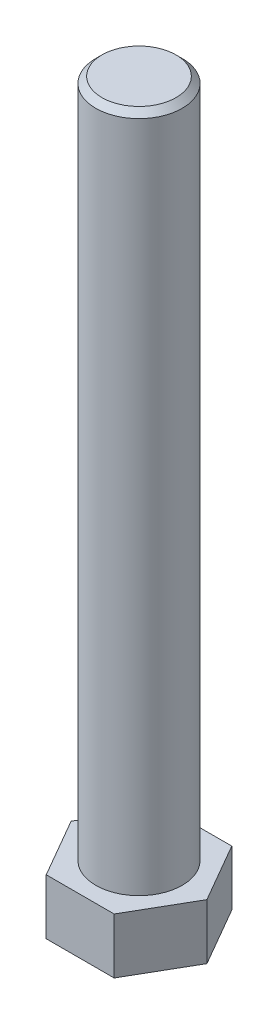
ISO-10303-21;
HEADER;
FILE_DESCRIPTION(('STEP AP214'),'2;1');
FILE_NAME('part.step','',(''),(''),'','','');
FILE_SCHEMA(('AUTOMOTIVE_DESIGN { 1 0 10303 214 1 1 1 1 }'));
ENDSEC;
DATA;
#1=APPLICATION_CONTEXT('core data for automotive mechanical design processes');
#2=APPLICATION_PROTOCOL_DEFINITION('international standard','automotive_design',2000,#1);
#3=PRODUCT_CONTEXT('',#1,'mechanical');
#4=PRODUCT('Part','Part','',(#3));
#5=PRODUCT_RELATED_PRODUCT_CATEGORY('part','',(#4));
#6=PRODUCT_DEFINITION_FORMATION('','',#4);
#7=PRODUCT_DEFINITION_CONTEXT('part definition',#1,'design');
#8=PRODUCT_DEFINITION('design','',#6,#7);
#9=PRODUCT_DEFINITION_SHAPE('','',#8);
#10=(LENGTH_UNIT() NAMED_UNIT(*) SI_UNIT(.MILLI.,.METRE.));
#11=(NAMED_UNIT(*) PLANE_ANGLE_UNIT() SI_UNIT($,.RADIAN.));
#12=(NAMED_UNIT(*) SI_UNIT($,.STERADIAN.) SOLID_ANGLE_UNIT());
#13=UNCERTAINTY_MEASURE_WITH_UNIT(LENGTH_MEASURE(1.E-05),#10,'distance_accuracy_value','');
#14=(GEOMETRIC_REPRESENTATION_CONTEXT(3) GLOBAL_UNCERTAINTY_ASSIGNED_CONTEXT((#13)) GLOBAL_UNIT_ASSIGNED_CONTEXT((#10,
#11,#12)) REPRESENTATION_CONTEXT('',''));
#15=CARTESIAN_POINT('',(0.,0.,0.));
#16=DIRECTION('',(0.,0.,1.));
#17=DIRECTION('',(1.,0.,0.));
#18=AXIS2_PLACEMENT_3D('',#15,#16,#17);
#19=CARTESIAN_POINT('',(5.50000000000011,8.98,9.52627944162876));
#20=DIRECTION('',(-0.866025403784441,0.,-0.499999999999995));
#21=DIRECTION('',(-0.499999999999995,0.,0.866025403784442));
#22=AXIS2_PLACEMENT_3D('',#19,#20,#21);
#23=PLANE('',#22);
#24=DIRECTION('',(0.499999999999995,0.,-0.866025403784441));
#25=VECTOR('',#24,1.);
#26=CARTESIAN_POINT('',(5.50000000000011,0.,9.52627944162876));
#27=LINE('',#26,#25);
#28=CARTESIAN_POINT('',(5.50000000000011,0.,9.52627944162876));
#29=VERTEX_POINT('',#28);
#30=CARTESIAN_POINT('',(11.,0.,0.));
#31=VERTEX_POINT('',#30);
#32=EDGE_CURVE('E137',#29,#31,#27,.T.);
#33=ORIENTED_EDGE('',*,*,#32,.T.);
#34=DIRECTION('',(0.,-1.,0.));
#35=VECTOR('',#34,1.);
#36=CARTESIAN_POINT('',(11.,8.98,0.));
#37=LINE('',#36,#35);
#38=CARTESIAN_POINT('',(11.,8.98,0.));
#39=VERTEX_POINT('',#38);
#40=EDGE_CURVE('E164',#39,#31,#37,.T.);
#41=ORIENTED_EDGE('',*,*,#40,.F.);
#42=DIRECTION('',(0.499999999999995,0.,-0.866025403784441));
#43=VECTOR('',#42,1.);
#44=CARTESIAN_POINT('',(5.50000000000011,8.98,9.52627944162876));
#45=LINE('',#44,#43);
#46=CARTESIAN_POINT('',(5.50000000000011,8.98,9.52627944162876));
#47=VERTEX_POINT('',#46);
#48=EDGE_CURVE('E153',#47,#39,#45,.T.);
#49=ORIENTED_EDGE('',*,*,#48,.F.);
#50=DIRECTION('',(0.,-1.,0.));
#51=VECTOR('',#50,1.);
#52=CARTESIAN_POINT('',(5.50000000000011,8.98,9.52627944162876));
#53=LINE('',#52,#51);
#54=EDGE_CURVE('E133',#47,#29,#53,.T.);
#55=ORIENTED_EDGE('',*,*,#54,.T.);
#56=EDGE_LOOP('',(#33,#41,#49,#55));
#57=FACE_BOUND('',#56,.T.);
#58=ADVANCED_FACE('F45',(#57),#23,.F.);
#59=CARTESIAN_POINT('',(11.,8.98,0.));
#60=DIRECTION('',(-0.866025403784438,0.,0.500000000000001));
#61=DIRECTION('',(0.500000000000001,0.,0.866025403784438));
#62=AXIS2_PLACEMENT_3D('',#59,#60,#61);
#63=PLANE('',#62);
#64=DIRECTION('',(-0.500000000000001,0.,-0.866025403784438));
#65=VECTOR('',#64,1.);
#66=CARTESIAN_POINT('',(11.,0.,0.));
#67=LINE('',#66,#65);
#68=CARTESIAN_POINT('',(5.49999999999998,0.,-9.52627944162884));
#69=VERTEX_POINT('',#68);
#70=EDGE_CURVE('E141',#31,#69,#67,.T.);
#71=ORIENTED_EDGE('',*,*,#70,.T.);
#72=DIRECTION('',(0.,-1.,0.));
#73=VECTOR('',#72,1.);
#74=CARTESIAN_POINT('',(5.49999999999998,8.98,-9.52627944162884));
#75=LINE('',#74,#73);
#76=CARTESIAN_POINT('',(5.49999999999998,8.98,-9.52627944162884));
#77=VERTEX_POINT('',#76);
#78=EDGE_CURVE('E160',#77,#69,#75,.T.);
#79=ORIENTED_EDGE('',*,*,#78,.F.);
#80=DIRECTION('',(-0.500000000000001,0.,-0.866025403784438));
#81=VECTOR('',#80,1.);
#82=CARTESIAN_POINT('',(11.,8.98,0.));
#83=LINE('',#82,#81);
#84=EDGE_CURVE('E102',#39,#77,#83,.T.);
#85=ORIENTED_EDGE('',*,*,#84,.F.);
#86=ORIENTED_EDGE('',*,*,#40,.T.);
#87=EDGE_LOOP('',(#71,#79,#85,#86));
#88=FACE_BOUND('',#87,.T.);
#89=ADVANCED_FACE('F183',(#88),#63,.F.);
#90=CARTESIAN_POINT('',(5.49999999999998,8.98,-9.52627944162884));
#91=DIRECTION('',(0.,0.,1.));
#92=DIRECTION('',(1.,0.,0.));
#93=AXIS2_PLACEMENT_3D('',#90,#91,#92);
#94=PLANE('',#93);
#95=DIRECTION('',(-1.,0.,0.));
#96=VECTOR('',#95,1.);
#97=CARTESIAN_POINT('',(5.49999999999998,0.,-9.52627944162884));
#98=LINE('',#97,#96);
#99=CARTESIAN_POINT('',(-5.50000000000004,0.,-9.5262794416288));
#100=VERTEX_POINT('',#99);
#101=EDGE_CURVE('E144',#69,#100,#98,.T.);
#102=ORIENTED_EDGE('',*,*,#101,.T.);
#103=DIRECTION('',(0.,-1.,0.));
#104=VECTOR('',#103,1.);
#105=CARTESIAN_POINT('',(-5.50000000000004,8.98,-9.5262794416288));
#106=LINE('',#105,#104);
#107=CARTESIAN_POINT('',(-5.50000000000004,8.98,-9.5262794416288));
#108=VERTEX_POINT('',#107);
#109=EDGE_CURVE('E126',#108,#100,#106,.T.);
#110=ORIENTED_EDGE('',*,*,#109,.F.);
#111=DIRECTION('',(-1.,0.,0.));
#112=VECTOR('',#111,1.);
#113=CARTESIAN_POINT('',(5.49999999999998,8.98,-9.52627944162884));
#114=LINE('',#113,#112);
#115=EDGE_CURVE('E115',#77,#108,#114,.T.);
#116=ORIENTED_EDGE('',*,*,#115,.F.);
#117=ORIENTED_EDGE('',*,*,#78,.T.);
#118=EDGE_LOOP('',(#102,#110,#116,#117));
#119=FACE_BOUND('',#118,.T.);
#120=ADVANCED_FACE('F186',(#119),#94,.F.);
#121=CARTESIAN_POINT('',(-5.50000000000004,8.98,-9.5262794416288));
#122=DIRECTION('',(0.866025403784442,0.,0.499999999999995));
#123=DIRECTION('',(0.499999999999995,0.,-0.866025403784442));
#124=AXIS2_PLACEMENT_3D('',#121,#122,#123);
#125=PLANE('',#124);
#126=DIRECTION('',(-0.499999999999995,0.,0.866025403784441));
#127=VECTOR('',#126,1.);
#128=CARTESIAN_POINT('',(-5.50000000000004,0.,-9.5262794416288));
#129=LINE('',#128,#127);
#130=CARTESIAN_POINT('',(-11.,0.,0.));
#131=VERTEX_POINT('',#130);
#132=EDGE_CURVE('E124',#100,#131,#129,.T.);
#133=ORIENTED_EDGE('',*,*,#132,.T.);
#134=DIRECTION('',(0.,-1.,0.));
#135=VECTOR('',#134,1.);
#136=CARTESIAN_POINT('',(-11.,8.98,0.));
#137=LINE('',#136,#135);
#138=CARTESIAN_POINT('',(-11.,8.98,0.));
#139=VERTEX_POINT('',#138);
#140=EDGE_CURVE('E121',#139,#131,#137,.T.);
#141=ORIENTED_EDGE('',*,*,#140,.F.);
#142=DIRECTION('',(-0.499999999999995,0.,0.866025403784441));
#143=VECTOR('',#142,1.);
#144=CARTESIAN_POINT('',(-5.50000000000004,8.98,-9.5262794416288));
#145=LINE('',#144,#143);
#146=EDGE_CURVE('E109',#108,#139,#145,.T.);
#147=ORIENTED_EDGE('',*,*,#146,.F.);
#148=ORIENTED_EDGE('',*,*,#109,.T.);
#149=EDGE_LOOP('',(#133,#141,#147,#148));
#150=FACE_BOUND('',#149,.T.);
#151=ADVANCED_FACE('F122',(#150),#125,.F.);
#152=CARTESIAN_POINT('',(-11.,8.98,0.));
#153=DIRECTION('',(0.866025403784434,0.,-0.500000000000007));
#154=DIRECTION('',(-0.500000000000007,0.,-0.866025403784435));
#155=AXIS2_PLACEMENT_3D('',#152,#153,#154);
#156=PLANE('',#155);
#157=DIRECTION('',(0.500000000000007,0.,0.866025403784434));
#158=VECTOR('',#157,1.);
#159=CARTESIAN_POINT('',(-11.,0.,0.));
#160=LINE('',#159,#158);
#161=CARTESIAN_POINT('',(-5.49999999999991,0.,9.52627944162887));
#162=VERTEX_POINT('',#161);
#163=EDGE_CURVE('E87',#131,#162,#160,.T.);
#164=ORIENTED_EDGE('',*,*,#163,.T.);
#165=DIRECTION('',(0.,-1.,0.));
#166=VECTOR('',#165,1.);
#167=CARTESIAN_POINT('',(-5.49999999999991,8.98,9.52627944162887));
#168=LINE('',#167,#166);
#169=CARTESIAN_POINT('',(-5.49999999999991,8.98,9.52627944162887));
#170=VERTEX_POINT('',#169);
#171=EDGE_CURVE('E127',#170,#162,#168,.T.);
#172=ORIENTED_EDGE('',*,*,#171,.F.);
#173=DIRECTION('',(0.500000000000007,0.,0.866025403784434));
#174=VECTOR('',#173,1.);
#175=CARTESIAN_POINT('',(-11.,8.98,0.));
#176=LINE('',#175,#174);
#177=EDGE_CURVE('E113',#139,#170,#176,.T.);
#178=ORIENTED_EDGE('',*,*,#177,.F.);
#179=ORIENTED_EDGE('',*,*,#140,.T.);
#180=EDGE_LOOP('',(#164,#172,#178,#179));
#181=FACE_BOUND('',#180,.T.);
#182=ADVANCED_FACE('F129',(#181),#156,.F.);
#183=CARTESIAN_POINT('',(-5.49999999999991,8.98,9.52627944162887));
#184=DIRECTION('',(0.,0.,-1.));
#185=DIRECTION('',(-1.,0.,0.));
#186=AXIS2_PLACEMENT_3D('',#183,#184,#185);
#187=PLANE('',#186);
#188=DIRECTION('',(1.,0.,0.));
#189=VECTOR('',#188,1.);
#190=CARTESIAN_POINT('',(-5.49999999999991,0.,9.52627944162887));
#191=LINE('',#190,#189);
#192=EDGE_CURVE('E93',#162,#29,#191,.T.);
#193=ORIENTED_EDGE('',*,*,#192,.T.);
#194=ORIENTED_EDGE('',*,*,#54,.F.);
#195=DIRECTION('',(1.,0.,0.));
#196=VECTOR('',#195,1.);
#197=CARTESIAN_POINT('',(-5.49999999999991,8.98,9.52627944162887));
#198=LINE('',#197,#196);
#199=EDGE_CURVE('E64',#170,#47,#198,.T.);
#200=ORIENTED_EDGE('',*,*,#199,.F.);
#201=ORIENTED_EDGE('',*,*,#171,.T.);
#202=EDGE_LOOP('',(#193,#194,#200,#201));
#203=FACE_BOUND('',#202,.T.);
#204=ADVANCED_FACE('F191',(#203),#187,.F.);
#205=CARTESIAN_POINT('',(0.,8.98,0.));
#206=DIRECTION('',(0.,1.,0.));
#207=DIRECTION('',(0.,0.,1.));
#208=AXIS2_PLACEMENT_3D('',#205,#206,#207);
#209=PLANE('',#208);
#210=CARTESIAN_POINT('',(0.,8.98,0.));
#211=DIRECTION('',(0.,1.,0.));
#212=DIRECTION('',(0.,0.,1.));
#213=AXIS2_PLACEMENT_3D('',#210,#211,#212);
#214=CIRCLE('',#213,7.);
#215=CARTESIAN_POINT('',(0.,8.98,7.));
#216=VERTEX_POINT('',#215);
#217=EDGE_CURVE('E166',#216,#216,#214,.T.);
#218=ORIENTED_EDGE('',*,*,#217,.F.);
#219=EDGE_LOOP('',(#218));
#220=FACE_BOUND('',#219,.T.);
#221=ORIENTED_EDGE('',*,*,#48,.T.);
#222=ORIENTED_EDGE('',*,*,#84,.T.);
#223=ORIENTED_EDGE('',*,*,#115,.T.);
#224=ORIENTED_EDGE('',*,*,#146,.T.);
#225=ORIENTED_EDGE('',*,*,#177,.T.);
#226=ORIENTED_EDGE('',*,*,#199,.T.);
#227=EDGE_LOOP('',(#221,#222,#223,#224,#225,#226));
#228=FACE_BOUND('',#227,.T.);
#229=ADVANCED_FACE('F111',(#220,#228),#209,.T.);
#230=CARTESIAN_POINT('',(0.,0.,0.));
#231=DIRECTION('',(0.,1.,0.));
#232=DIRECTION('',(0.,0.,1.));
#233=AXIS2_PLACEMENT_3D('',#230,#231,#232);
#234=PLANE('',#233);
#235=ORIENTED_EDGE('',*,*,#32,.F.);
#236=ORIENTED_EDGE('',*,*,#192,.F.);
#237=ORIENTED_EDGE('',*,*,#163,.F.);
#238=ORIENTED_EDGE('',*,*,#132,.F.);
#239=ORIENTED_EDGE('',*,*,#101,.F.);
#240=ORIENTED_EDGE('',*,*,#70,.F.);
#241=EDGE_LOOP('',(#235,#236,#237,#238,#239,#240));
#242=FACE_BOUND('',#241,.T.);
#243=ADVANCED_FACE('F189',(#242),#234,.F.);
#244=CARTESIAN_POINT('',(0.,118.98,0.));
#245=DIRECTION('',(0.,-1.,0.));
#246=DIRECTION('',(0.,0.,-1.));
#247=AXIS2_PLACEMENT_3D('',#244,#245,#246);
#248=CYLINDRICAL_SURFACE('',#247,7.);
#249=CARTESIAN_POINT('',(0.,117.98,0.));
#250=DIRECTION('',(0.,1.,0.));
#251=DIRECTION('',(0.,0.,1.));
#252=AXIS2_PLACEMENT_3D('',#249,#250,#251);
#253=CIRCLE('',#252,7.);
#254=CARTESIAN_POINT('',(0.,117.98,7.));
#255=VERTEX_POINT('',#254);
#256=EDGE_CURVE('E11',#255,#255,#253,.F.);
#257=ORIENTED_EDGE('',*,*,#256,.T.);
#258=EDGE_LOOP('',(#257));
#259=FACE_BOUND('',#258,.T.);
#260=ORIENTED_EDGE('',*,*,#217,.T.);
#261=EDGE_LOOP('',(#260));
#262=FACE_BOUND('',#261,.T.);
#263=ADVANCED_FACE('F235',(#259,#262),#248,.T.);
#264=CARTESIAN_POINT('',(0.,118.98,0.));
#265=DIRECTION('',(0.,1.,0.));
#266=DIRECTION('',(0.,0.,1.));
#267=AXIS2_PLACEMENT_3D('',#264,#265,#266);
#268=PLANE('',#267);
#269=CARTESIAN_POINT('',(0.,118.98,0.));
#270=DIRECTION('',(0.,1.,0.));
#271=DIRECTION('',(0.,0.,1.));
#272=AXIS2_PLACEMENT_3D('',#269,#270,#271);
#273=CIRCLE('',#272,6.00000000000001);
#274=CARTESIAN_POINT('',(0.,118.98,6.00000000000001));
#275=VERTEX_POINT('',#274);
#276=EDGE_CURVE('E56',#275,#275,#273,.T.);
#277=ORIENTED_EDGE('',*,*,#276,.T.);
#278=EDGE_LOOP('',(#277));
#279=FACE_BOUND('',#278,.T.);
#280=ADVANCED_FACE('F250',(#279),#268,.T.);
#281=CARTESIAN_POINT('',(0.,118.98,0.));
#282=DIRECTION('',(0.,-1.,0.));
#283=DIRECTION('',(0.,0.,-1.));
#284=AXIS2_PLACEMENT_3D('',#281,#282,#283);
#285=CONICAL_SURFACE('',#284,6.00000000000001,0.785398163397445);
#286=ORIENTED_EDGE('',*,*,#256,.F.);
#287=EDGE_LOOP('',(#286));
#288=FACE_BOUND('',#287,.T.);
#289=ORIENTED_EDGE('',*,*,#276,.F.);
#290=EDGE_LOOP('',(#289));
#291=FACE_BOUND('',#290,.T.);
#292=ADVANCED_FACE('F48',(#288,#291),#285,.T.);
#293=CLOSED_SHELL('',(#58,#89,#120,#151,#182,#204,#229,#243,#263,#280,#292));
#294=MANIFOLD_SOLID_BREP('B2',#293);
#295=ADVANCED_BREP_SHAPE_REPRESENTATION('',(#18,#294),#14);
#296=SHAPE_DEFINITION_REPRESENTATION(#9,#295);
ENDSEC;
END-ISO-10303-21;
